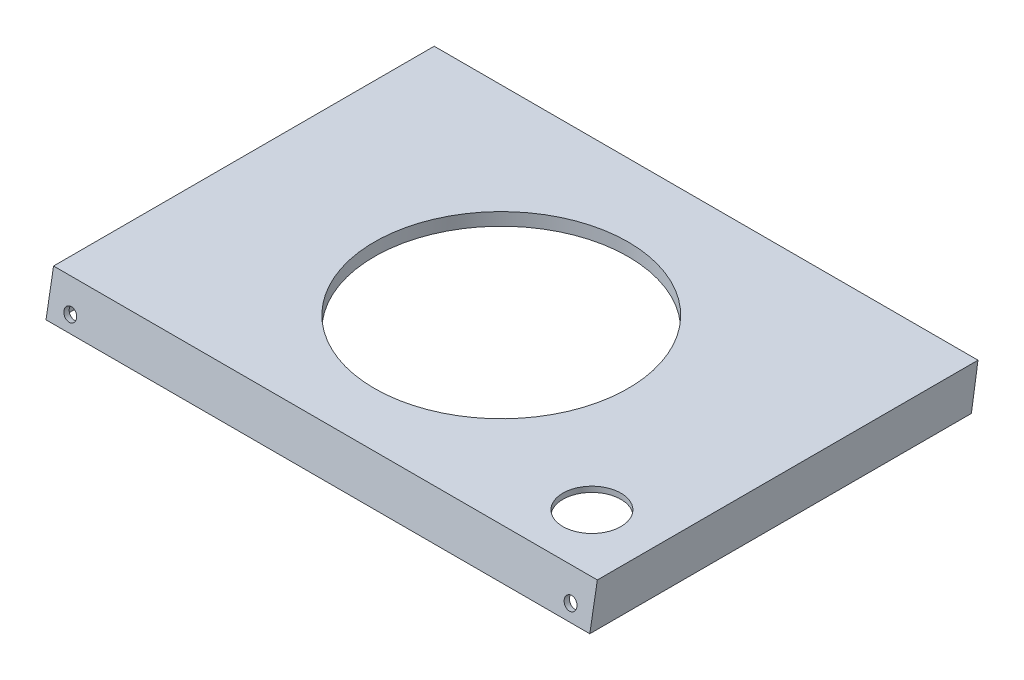
ISO-10303-21;
HEADER;
FILE_DESCRIPTION(('STEP AP214'),'2;1');
FILE_NAME('part.step','',(''),(''),'','','');
FILE_SCHEMA(('AUTOMOTIVE_DESIGN { 1 0 10303 214 1 1 1 1 }'));
ENDSEC;
DATA;
#1=APPLICATION_CONTEXT('core data for automotive mechanical design processes');
#2=APPLICATION_PROTOCOL_DEFINITION('international standard','automotive_design',2000,#1);
#3=PRODUCT_CONTEXT('',#1,'mechanical');
#4=PRODUCT('Part','Part','',(#3));
#5=PRODUCT_RELATED_PRODUCT_CATEGORY('part','',(#4));
#6=PRODUCT_DEFINITION_FORMATION('','',#4);
#7=PRODUCT_DEFINITION_CONTEXT('part definition',#1,'design');
#8=PRODUCT_DEFINITION('design','',#6,#7);
#9=PRODUCT_DEFINITION_SHAPE('','',#8);
#10=(LENGTH_UNIT() NAMED_UNIT(*) SI_UNIT(.MILLI.,.METRE.));
#11=(NAMED_UNIT(*) PLANE_ANGLE_UNIT() SI_UNIT($,.RADIAN.));
#12=(NAMED_UNIT(*) SI_UNIT($,.STERADIAN.) SOLID_ANGLE_UNIT());
#13=UNCERTAINTY_MEASURE_WITH_UNIT(LENGTH_MEASURE(1.E-05),#10,'distance_accuracy_value','');
#14=(GEOMETRIC_REPRESENTATION_CONTEXT(3) GLOBAL_UNCERTAINTY_ASSIGNED_CONTEXT((#13)) GLOBAL_UNIT_ASSIGNED_CONTEXT((#10,
#11,#12)) REPRESENTATION_CONTEXT('',''));
#15=CARTESIAN_POINT('',(0.,0.,0.));
#16=DIRECTION('',(0.,0.,1.));
#17=DIRECTION('',(1.,0.,0.));
#18=AXIS2_PLACEMENT_3D('',#15,#16,#17);
#19=CARTESIAN_POINT('',(0.,0.,0.));
#20=DIRECTION('',(0.,-1.,0.));
#21=DIRECTION('',(0.,0.,-1.));
#22=AXIS2_PLACEMENT_3D('',#19,#20,#21);
#23=PLANE('',#22);
#24=CARTESIAN_POINT('',(131.,0.,-16.));
#25=DIRECTION('',(0.,1.,0.));
#26=DIRECTION('',(0.,0.,1.));
#27=AXIS2_PLACEMENT_3D('',#24,#25,#26);
#28=CIRCLE('',#27,8.00000000000001);
#29=CARTESIAN_POINT('',(131.,0.,-7.99999999999999));
#30=VERTEX_POINT('',#29);
#31=EDGE_CURVE('E207',#30,#30,#28,.T.);
#32=ORIENTED_EDGE('',*,*,#31,.T.);
#33=EDGE_LOOP('',(#32));
#34=FACE_BOUND('',#33,.T.);
#35=DIRECTION('',(-1.,0.,0.));
#36=VECTOR('',#35,1.);
#37=CARTESIAN_POINT('',(0.,0.,-103.476860082171));
#38=LINE('',#37,#36);
#39=CARTESIAN_POINT('',(147.,0.,-103.476860082171));
#40=VERTEX_POINT('',#39);
#41=CARTESIAN_POINT('',(0.,0.,-103.476860082171));
#42=VERTEX_POINT('',#41);
#43=EDGE_CURVE('E196',#40,#42,#38,.T.);
#44=ORIENTED_EDGE('',*,*,#43,.F.);
#45=DIRECTION('',(0.,0.,-1.));
#46=VECTOR('',#45,1.);
#47=CARTESIAN_POINT('',(147.,0.,0.));
#48=LINE('',#47,#46);
#49=CARTESIAN_POINT('',(147.,0.,-1.25864944676594));
#50=VERTEX_POINT('',#49);
#51=EDGE_CURVE('E55',#50,#40,#48,.T.);
#52=ORIENTED_EDGE('',*,*,#51,.F.);
#53=DIRECTION('',(1.,0.,0.));
#54=VECTOR('',#53,1.);
#55=CARTESIAN_POINT('',(0.,0.,-1.25864944676594));
#56=LINE('',#55,#54);
#57=CARTESIAN_POINT('',(0.,0.,-1.25864944676594));
#58=VERTEX_POINT('',#57);
#59=EDGE_CURVE('E50',#58,#50,#56,.T.);
#60=ORIENTED_EDGE('',*,*,#59,.F.);
#61=DIRECTION('',(0.,0.,1.));
#62=VECTOR('',#61,1.);
#63=CARTESIAN_POINT('',(0.,0.,0.));
#64=LINE('',#63,#62);
#65=EDGE_CURVE('E216',#42,#58,#64,.T.);
#66=ORIENTED_EDGE('',*,*,#65,.F.);
#67=EDGE_LOOP('',(#44,#52,#60,#66));
#68=FACE_BOUND('',#67,.T.);
#69=CARTESIAN_POINT('',(141.,0.,-95.657572421231));
#70=DIRECTION('',(0.,-1.,0.));
#71=DIRECTION('',(0.,0.,-1.));
#72=AXIS2_PLACEMENT_3D('',#69,#70,#71);
#73=CIRCLE('',#72,2.99999999999999);
#74=CARTESIAN_POINT('',(141.,0.,-98.657572421231));
#75=VERTEX_POINT('',#74);
#76=EDGE_CURVE('E150',#75,#75,#73,.T.);
#77=ORIENTED_EDGE('',*,*,#76,.F.);
#78=EDGE_LOOP('',(#77));
#79=FACE_BOUND('',#78,.T.);
#80=CARTESIAN_POINT('',(117.,0.,-95.657572421231));
#81=DIRECTION('',(0.,-1.,0.));
#82=DIRECTION('',(0.,0.,1.));
#83=AXIS2_PLACEMENT_3D('',#80,#81,#82);
#84=CIRCLE('',#83,3.00000000000001);
#85=CARTESIAN_POINT('',(117.,0.,-92.657572421231));
#86=VERTEX_POINT('',#85);
#87=EDGE_CURVE('E429',#86,#86,#84,.T.);
#88=ORIENTED_EDGE('',*,*,#87,.F.);
#89=EDGE_LOOP('',(#88));
#90=FACE_BOUND('',#89,.T.);
#91=CARTESIAN_POINT('',(117.,0.,-48.657572421231));
#92=DIRECTION('',(0.,-1.,0.));
#93=DIRECTION('',(0.,0.,-1.));
#94=AXIS2_PLACEMENT_3D('',#91,#92,#93);
#95=CIRCLE('',#94,3.00000000000001);
#96=CARTESIAN_POINT('',(117.,0.,-51.657572421231));
#97=VERTEX_POINT('',#96);
#98=EDGE_CURVE('E420',#97,#97,#95,.T.);
#99=ORIENTED_EDGE('',*,*,#98,.F.);
#100=EDGE_LOOP('',(#99));
#101=FACE_BOUND('',#100,.T.);
#102=CARTESIAN_POINT('',(141.,0.,-48.657572421231));
#103=DIRECTION('',(0.,-1.,0.));
#104=DIRECTION('',(0.,0.,1.));
#105=AXIS2_PLACEMENT_3D('',#102,#103,#104);
#106=CIRCLE('',#105,2.99999999999999);
#107=CARTESIAN_POINT('',(141.,0.,-45.657572421231));
#108=VERTEX_POINT('',#107);
#109=EDGE_CURVE('E411',#108,#108,#106,.T.);
#110=ORIENTED_EDGE('',*,*,#109,.F.);
#111=EDGE_LOOP('',(#110));
#112=FACE_BOUND('',#111,.T.);
#113=CARTESIAN_POINT('',(72.,0.,-50.));
#114=DIRECTION('',(0.,-1.,0.));
#115=DIRECTION('',(0.,0.,-1.));
#116=AXIS2_PLACEMENT_3D('',#113,#114,#115);
#117=CIRCLE('',#116,36.5);
#118=CARTESIAN_POINT('',(72.,0.,-86.5));
#119=VERTEX_POINT('',#118);
#120=EDGE_CURVE('E376',#119,#119,#117,.T.);
#121=ORIENTED_EDGE('',*,*,#120,.F.);
#122=EDGE_LOOP('',(#121));
#123=FACE_BOUND('',#122,.T.);
#124=ADVANCED_FACE('F35',(#34,#68,#79,#90,#101,#112,#123),#23,.T.);
#125=CARTESIAN_POINT('',(0.,1.5,0.));
#126=DIRECTION('',(1.,0.,0.));
#127=DIRECTION('',(0.,0.,-1.));
#128=AXIS2_PLACEMENT_3D('',#125,#126,#127);
#129=PLANE('',#128);
#130=DIRECTION('',(0.,-0.988356848189496,0.152153674411518));
#131=VECTOR('',#130,1.);
#132=CARTESIAN_POINT('',(0.,-10.3176930361465,-103.18071233906));
#133=LINE('',#132,#131);
#134=CARTESIAN_POINT('',(0.,1.5,-105.));
#135=VERTEX_POINT('',#134);
#136=CARTESIAN_POINT('',(0.,-10.3176930361465,-103.18071233906));
#137=VERTEX_POINT('',#136);
#138=EDGE_CURVE('E144',#135,#137,#133,.T.);
#139=ORIENTED_EDGE('',*,*,#138,.F.);
#140=DIRECTION('',(0.,-1.,0.));
#141=VECTOR('',#140,1.);
#142=CARTESIAN_POINT('',(0.,1.5,-105.));
#143=LINE('',#142,#141);
#144=CARTESIAN_POINT('',(0.,0.,-105.));
#145=VERTEX_POINT('',#144);
#146=EDGE_CURVE('E222',#135,#145,#143,.T.);
#147=ORIENTED_EDGE('',*,*,#146,.T.);
#148=DIRECTION('',(0.,-0.984807753012209,0.173648177666924));
#149=VECTOR('',#148,1.);
#150=CARTESIAN_POINT('',(0.,0.,-105.));
#151=LINE('',#150,#149);
#152=EDGE_CURVE('E183',#145,#137,#151,.T.);
#153=ORIENTED_EDGE('',*,*,#152,.T.);
#154=EDGE_LOOP('',(#139,#147,#153));
#155=FACE_BOUND('',#154,.T.);
#156=ADVANCED_FACE('F37',(#155),#129,.F.);
#157=CARTESIAN_POINT('',(147.,1.5,0.));
#158=DIRECTION('',(-1.,0.,0.));
#159=DIRECTION('',(0.,0.,1.));
#160=AXIS2_PLACEMENT_3D('',#157,#158,#159);
#161=PLANE('',#160);
#162=DIRECTION('',(0.,0.988356848189496,-0.152153674411518));
#163=VECTOR('',#162,1.);
#164=CARTESIAN_POINT('',(147.,1.5,-105.));
#165=LINE('',#164,#163);
#166=CARTESIAN_POINT('',(147.,-10.3176930361465,-103.18071233906));
#167=VERTEX_POINT('',#166);
#168=CARTESIAN_POINT('',(147.,1.5,-105.));
#169=VERTEX_POINT('',#168);
#170=EDGE_CURVE('E166',#167,#169,#165,.T.);
#171=ORIENTED_EDGE('',*,*,#170,.F.);
#172=DIRECTION('',(0.,-0.984807753012209,0.173648177666924));
#173=VECTOR('',#172,1.);
#174=CARTESIAN_POINT('',(147.,0.,-105.));
#175=LINE('',#174,#173);
#176=CARTESIAN_POINT('',(147.,0.,-105.));
#177=VERTEX_POINT('',#176);
#178=EDGE_CURVE('E184',#177,#167,#175,.T.);
#179=ORIENTED_EDGE('',*,*,#178,.F.);
#180=DIRECTION('',(0.,-1.,0.));
#181=VECTOR('',#180,1.);
#182=CARTESIAN_POINT('',(147.,1.5,-105.));
#183=LINE('',#182,#181);
#184=EDGE_CURVE('E230',#169,#177,#183,.T.);
#185=ORIENTED_EDGE('',*,*,#184,.F.);
#186=EDGE_LOOP('',(#171,#179,#185));
#187=FACE_BOUND('',#186,.T.);
#188=ADVANCED_FACE('F277',(#187),#161,.F.);
#189=CARTESIAN_POINT('',(0.,1.5,0.));
#190=DIRECTION('',(0.,-1.,0.));
#191=DIRECTION('',(0.,0.,-1.));
#192=AXIS2_PLACEMENT_3D('',#189,#190,#191);
#193=PLANE('',#192);
#194=DIRECTION('',(1.,0.,0.));
#195=VECTOR('',#194,1.);
#196=CARTESIAN_POINT('',(0.,1.5,0.));
#197=LINE('',#196,#195);
#198=CARTESIAN_POINT('',(-1.5,1.5,0.));
#199=VERTEX_POINT('',#198);
#200=CARTESIAN_POINT('',(148.5,1.5,0.));
#201=VERTEX_POINT('',#200);
#202=EDGE_CURVE('E135',#199,#201,#197,.T.);
#203=ORIENTED_EDGE('',*,*,#202,.T.);
#204=DIRECTION('',(0.,0.,1.));
#205=VECTOR('',#204,1.);
#206=CARTESIAN_POINT('',(148.5,1.5,0.));
#207=LINE('',#206,#205);
#208=CARTESIAN_POINT('',(148.5,1.5,-105.));
#209=VERTEX_POINT('',#208);
#210=EDGE_CURVE('E168',#209,#201,#207,.T.);
#211=ORIENTED_EDGE('',*,*,#210,.F.);
#212=DIRECTION('',(-1.,0.,0.));
#213=VECTOR('',#212,1.);
#214=CARTESIAN_POINT('',(148.5,1.5,-105.));
#215=LINE('',#214,#213);
#216=EDGE_CURVE('E173',#209,#169,#215,.T.);
#217=ORIENTED_EDGE('',*,*,#216,.T.);
#218=DIRECTION('',(-1.,0.,0.));
#219=VECTOR('',#218,1.);
#220=CARTESIAN_POINT('',(0.,1.5,-105.));
#221=LINE('',#220,#219);
#222=EDGE_CURVE('E218',#169,#135,#221,.T.);
#223=ORIENTED_EDGE('',*,*,#222,.T.);
#224=DIRECTION('',(1.,0.,0.));
#225=VECTOR('',#224,1.);
#226=CARTESIAN_POINT('',(-1.5,1.5,-105.));
#227=LINE('',#226,#225);
#228=CARTESIAN_POINT('',(-1.5,1.5,-105.));
#229=VERTEX_POINT('',#228);
#230=EDGE_CURVE('E160',#229,#135,#227,.T.);
#231=ORIENTED_EDGE('',*,*,#230,.F.);
#232=DIRECTION('',(0.,0.,-1.));
#233=VECTOR('',#232,1.);
#234=CARTESIAN_POINT('',(-1.5,1.5,-105.));
#235=LINE('',#234,#233);
#236=EDGE_CURVE('E138',#199,#229,#235,.T.);
#237=ORIENTED_EDGE('',*,*,#236,.F.);
#238=EDGE_LOOP('',(#203,#211,#217,#223,#231,#237));
#239=FACE_BOUND('',#238,.T.);
#240=CARTESIAN_POINT('',(72.,1.5,-50.));
#241=DIRECTION('',(0.,1.,0.));
#242=DIRECTION('',(0.,0.,1.));
#243=AXIS2_PLACEMENT_3D('',#240,#241,#242);
#244=CIRCLE('',#243,35.);
#245=CARTESIAN_POINT('',(72.,1.5,-15.));
#246=VERTEX_POINT('',#245);
#247=EDGE_CURVE('E211',#246,#246,#244,.T.);
#248=ORIENTED_EDGE('',*,*,#247,.F.);
#249=EDGE_LOOP('',(#248));
#250=FACE_BOUND('',#249,.T.);
#251=CARTESIAN_POINT('',(131.,1.5,-16.));
#252=DIRECTION('',(0.,1.,0.));
#253=DIRECTION('',(0.,0.,1.));
#254=AXIS2_PLACEMENT_3D('',#251,#252,#253);
#255=CIRCLE('',#254,8.00000000000001);
#256=CARTESIAN_POINT('',(131.,1.5,-7.99999999999999));
#257=VERTEX_POINT('',#256);
#258=EDGE_CURVE('E208',#257,#257,#255,.T.);
#259=ORIENTED_EDGE('',*,*,#258,.F.);
#260=EDGE_LOOP('',(#259));
#261=FACE_BOUND('',#260,.T.);
#262=ADVANCED_FACE('F355',(#239,#250,#261),#193,.F.);
#263=CARTESIAN_POINT('',(0.,1.5,-105.));
#264=DIRECTION('',(0.,0.,1.));
#265=DIRECTION('',(1.,0.,0.));
#266=AXIS2_PLACEMENT_3D('',#263,#264,#265);
#267=PLANE('',#266);
#268=DIRECTION('',(-1.,0.,0.));
#269=VECTOR('',#268,1.);
#270=CARTESIAN_POINT('',(0.,0.,-105.));
#271=LINE('',#270,#269);
#272=EDGE_CURVE('E219',#177,#145,#271,.T.);
#273=ORIENTED_EDGE('',*,*,#272,.T.);
#274=ORIENTED_EDGE('',*,*,#146,.F.);
#275=ORIENTED_EDGE('',*,*,#222,.F.);
#276=ORIENTED_EDGE('',*,*,#184,.T.);
#277=EDGE_LOOP('',(#273,#274,#275,#276));
#278=FACE_BOUND('',#277,.T.);
#279=ADVANCED_FACE('F353',(#278),#267,.F.);
#280=CARTESIAN_POINT('',(72.,1.5,-50.));
#281=DIRECTION('',(0.,-1.,0.));
#282=DIRECTION('',(0.,0.,-1.));
#283=AXIS2_PLACEMENT_3D('',#280,#281,#282);
#284=CYLINDRICAL_SURFACE('',#283,35.);
#285=ORIENTED_EDGE('',*,*,#247,.T.);
#286=EDGE_LOOP('',(#285));
#287=FACE_BOUND('',#286,.T.);
#288=CARTESIAN_POINT('',(72.,-2.,-50.));
#289=DIRECTION('',(0.,-1.,0.));
#290=DIRECTION('',(0.,0.,-1.));
#291=AXIS2_PLACEMENT_3D('',#288,#289,#290);
#292=CIRCLE('',#291,35.);
#293=CARTESIAN_POINT('',(72.,-2.,-85.));
#294=VERTEX_POINT('',#293);
#295=EDGE_CURVE('E374',#294,#294,#292,.T.);
#296=ORIENTED_EDGE('',*,*,#295,.T.);
#297=EDGE_LOOP('',(#296));
#298=FACE_BOUND('',#297,.T.);
#299=ADVANCED_FACE('F350',(#287,#298),#284,.F.);
#300=CARTESIAN_POINT('',(131.,1.5,-16.));
#301=DIRECTION('',(0.,-1.,0.));
#302=DIRECTION('',(0.,0.,-1.));
#303=AXIS2_PLACEMENT_3D('',#300,#301,#302);
#304=CYLINDRICAL_SURFACE('',#303,8.00000000000001);
#305=ORIENTED_EDGE('',*,*,#258,.T.);
#306=EDGE_LOOP('',(#305));
#307=FACE_BOUND('',#306,.T.);
#308=ORIENTED_EDGE('',*,*,#31,.F.);
#309=EDGE_LOOP('',(#308));
#310=FACE_BOUND('',#309,.T.);
#311=ADVANCED_FACE('F340',(#307,#310),#304,.F.);
#312=CARTESIAN_POINT('',(147.,1.5,0.));
#313=DIRECTION('',(0.,0.173648177666924,0.984807753012209));
#314=DIRECTION('',(0.,-0.984807753012209,0.173648177666924));
#315=AXIS2_PLACEMENT_3D('',#312,#313,#314);
#316=PLANE('',#315);
#317=CARTESIAN_POINT('',(4.49999999999999,-6.37846202409767,1.38918542133539));
#318=DIRECTION('',(0.,0.173648177666924,0.984807753012209));
#319=DIRECTION('',(0.,-0.984807753012209,0.173648177666924));
#320=AXIS2_PLACEMENT_3D('',#317,#318,#319);
#321=CIRCLE('',#320,1.74999999999999);
#322=CARTESIAN_POINT('',(4.49999999999999,-8.10187559186903,1.6930697322525));
#323=VERTEX_POINT('',#322);
#324=EDGE_CURVE('E385',#323,#323,#321,.T.);
#325=ORIENTED_EDGE('',*,*,#324,.F.);
#326=EDGE_LOOP('',(#325));
#327=FACE_BOUND('',#326,.T.);
#328=CARTESIAN_POINT('',(142.5,-6.37846202409767,1.38918542133539));
#329=DIRECTION('',(0.,0.173648177666924,0.984807753012209));
#330=DIRECTION('',(0.,0.984807753012209,-0.173648177666924));
#331=AXIS2_PLACEMENT_3D('',#328,#329,#330);
#332=CIRCLE('',#331,1.74999999999998);
#333=CARTESIAN_POINT('',(142.5,-4.65504845632633,1.08530111041828));
#334=VERTEX_POINT('',#333);
#335=EDGE_CURVE('E392',#334,#334,#332,.T.);
#336=ORIENTED_EDGE('',*,*,#335,.F.);
#337=EDGE_LOOP('',(#336));
#338=FACE_BOUND('',#337,.T.);
#339=ORIENTED_EDGE('',*,*,#202,.F.);
#340=DIRECTION('',(0.,0.984807753012209,-0.173648177666924));
#341=VECTOR('',#340,1.);
#342=CARTESIAN_POINT('',(-1.5,1.5,0.));
#343=LINE('',#342,#341);
#344=CARTESIAN_POINT('',(-1.5,-10.3176930361465,2.08377813200309));
#345=VERTEX_POINT('',#344);
#346=EDGE_CURVE('E133',#345,#199,#343,.T.);
#347=ORIENTED_EDGE('',*,*,#346,.F.);
#348=DIRECTION('',(-1.,0.,0.));
#349=VECTOR('',#348,1.);
#350=CARTESIAN_POINT('',(147.,-10.3176930361465,2.08377813200309));
#351=LINE('',#350,#349);
#352=CARTESIAN_POINT('',(148.5,-10.3176930361465,2.08377813200309));
#353=VERTEX_POINT('',#352);
#354=EDGE_CURVE('E118',#353,#345,#351,.T.);
#355=ORIENTED_EDGE('',*,*,#354,.F.);
#356=DIRECTION('',(0.,-0.984807753012209,0.173648177666924));
#357=VECTOR('',#356,1.);
#358=CARTESIAN_POINT('',(148.5,-10.3176930361465,2.08377813200309));
#359=LINE('',#358,#357);
#360=EDGE_CURVE('E171',#201,#353,#359,.T.);
#361=ORIENTED_EDGE('',*,*,#360,.F.);
#362=EDGE_LOOP('',(#339,#347,#355,#361));
#363=FACE_BOUND('',#362,.T.);
#364=ADVANCED_FACE('F134',(#327,#338,#363),#316,.T.);
#365=CARTESIAN_POINT('',(147.,-10.3176930361465,2.08377813200309));
#366=DIRECTION('',(0.,-1.,0.));
#367=DIRECTION('',(0.,0.,-1.));
#368=AXIS2_PLACEMENT_3D('',#365,#366,#367);
#369=PLANE('',#368);
#370=DIRECTION('',(-1.,0.,0.));
#371=VECTOR('',#370,1.);
#372=CARTESIAN_POINT('',(147.,-10.3176930361465,-101.657572421231));
#373=LINE('',#372,#371);
#374=CARTESIAN_POINT('',(147.,-10.3176930361465,-101.657572421231));
#375=VERTEX_POINT('',#374);
#376=CARTESIAN_POINT('',(0.,-10.3176930361465,-101.657572421231));
#377=VERTEX_POINT('',#376);
#378=EDGE_CURVE('E194',#375,#377,#373,.T.);
#379=ORIENTED_EDGE('',*,*,#378,.T.);
#380=DIRECTION('',(0.,0.,1.));
#381=VECTOR('',#380,1.);
#382=CARTESIAN_POINT('',(0.,-10.3176930361465,2.08377813200309));
#383=LINE('',#382,#381);
#384=CARTESIAN_POINT('',(0.,-10.3176930361465,0.56063821417447));
#385=VERTEX_POINT('',#384);
#386=EDGE_CURVE('E147',#377,#385,#383,.T.);
#387=ORIENTED_EDGE('',*,*,#386,.T.);
#388=DIRECTION('',(-1.,0.,0.));
#389=VECTOR('',#388,1.);
#390=CARTESIAN_POINT('',(147.,-10.3176930361465,0.56063821417447));
#391=LINE('',#390,#389);
#392=CARTESIAN_POINT('',(147.,-10.3176930361465,0.56063821417447));
#393=VERTEX_POINT('',#392);
#394=EDGE_CURVE('E130',#393,#385,#391,.T.);
#395=ORIENTED_EDGE('',*,*,#394,.F.);
#396=DIRECTION('',(0.,0.,-1.));
#397=VECTOR('',#396,1.);
#398=CARTESIAN_POINT('',(147.,-10.3176930361465,-103.18071233906));
#399=LINE('',#398,#397);
#400=EDGE_CURVE('E163',#393,#375,#399,.T.);
#401=ORIENTED_EDGE('',*,*,#400,.T.);
#402=EDGE_LOOP('',(#379,#387,#395,#401));
#403=FACE_BOUND('',#402,.T.);
#404=ORIENTED_EDGE('',*,*,#354,.T.);
#405=DIRECTION('',(0.,0.,1.));
#406=VECTOR('',#405,1.);
#407=CARTESIAN_POINT('',(-1.5,-10.3176930361465,2.08377813200309));
#408=LINE('',#407,#406);
#409=CARTESIAN_POINT('',(-1.5,-10.3176930361465,-103.18071233906));
#410=VERTEX_POINT('',#409);
#411=EDGE_CURVE('E123',#410,#345,#408,.T.);
#412=ORIENTED_EDGE('',*,*,#411,.F.);
#413=DIRECTION('',(1.,0.,0.));
#414=VECTOR('',#413,1.);
#415=CARTESIAN_POINT('',(-1.5,-10.3176930361465,-103.18071233906));
#416=LINE('',#415,#414);
#417=EDGE_CURVE('E155',#410,#137,#416,.T.);
#418=ORIENTED_EDGE('',*,*,#417,.T.);
#419=DIRECTION('',(-1.,0.,0.));
#420=VECTOR('',#419,1.);
#421=CARTESIAN_POINT('',(147.,-10.3176930361465,-103.18071233906));
#422=LINE('',#421,#420);
#423=EDGE_CURVE('E190',#167,#137,#422,.T.);
#424=ORIENTED_EDGE('',*,*,#423,.F.);
#425=DIRECTION('',(-1.,0.,0.));
#426=VECTOR('',#425,1.);
#427=CARTESIAN_POINT('',(148.5,-10.3176930361465,-103.18071233906));
#428=LINE('',#427,#426);
#429=CARTESIAN_POINT('',(148.5,-10.3176930361465,-103.18071233906));
#430=VERTEX_POINT('',#429);
#431=EDGE_CURVE('E180',#430,#167,#428,.T.);
#432=ORIENTED_EDGE('',*,*,#431,.F.);
#433=DIRECTION('',(0.,0.,-1.));
#434=VECTOR('',#433,1.);
#435=CARTESIAN_POINT('',(148.5,-10.3176930361465,-103.18071233906));
#436=LINE('',#435,#434);
#437=EDGE_CURVE('E126',#353,#430,#436,.T.);
#438=ORIENTED_EDGE('',*,*,#437,.F.);
#439=EDGE_LOOP('',(#404,#412,#418,#424,#432,#438));
#440=FACE_BOUND('',#439,.T.);
#441=ADVANCED_FACE('F120',(#403,#440),#369,.T.);
#442=CARTESIAN_POINT('',(147.,-10.3176930361465,0.56063821417447));
#443=DIRECTION('',(0.,-0.173648177666925,-0.984807753012209));
#444=DIRECTION('',(0.,0.984807753012209,-0.173648177666925));
#445=AXIS2_PLACEMENT_3D('',#442,#443,#444);
#446=PLANE('',#445);
#447=CARTESIAN_POINT('',(4.49999999999999,-6.63893429059806,-0.0880262081829064));
#448=DIRECTION('',(0.,-0.173648177666925,-0.984807753012209));
#449=DIRECTION('',(0.,0.984807753012209,-0.173648177666925));
#450=AXIS2_PLACEMENT_3D('',#447,#448,#449);
#451=CIRCLE('',#450,1.74999999999999);
#452=CARTESIAN_POINT('',(4.49999999999999,-4.91552072282671,-0.391910519100022));
#453=VERTEX_POINT('',#452);
#454=EDGE_CURVE('E389',#453,#453,#451,.F.);
#455=ORIENTED_EDGE('',*,*,#454,.T.);
#456=EDGE_LOOP('',(#455));
#457=FACE_BOUND('',#456,.T.);
#458=CARTESIAN_POINT('',(142.5,-6.63893429059806,-0.0880262081829064));
#459=DIRECTION('',(0.,-0.173648177666925,-0.984807753012209));
#460=DIRECTION('',(0.,0.984807753012209,-0.173648177666925));
#461=AXIS2_PLACEMENT_3D('',#458,#459,#460);
#462=CIRCLE('',#461,1.74999999999998);
#463=CARTESIAN_POINT('',(142.5,-4.91552072282671,-0.391910519100021));
#464=VERTEX_POINT('',#463);
#465=EDGE_CURVE('E383',#464,#464,#462,.F.);
#466=ORIENTED_EDGE('',*,*,#465,.T.);
#467=EDGE_LOOP('',(#466));
#468=FACE_BOUND('',#467,.T.);
#469=DIRECTION('',(0.,-0.984807753012209,0.173648177666925));
#470=VECTOR('',#469,1.);
#471=CARTESIAN_POINT('',(0.,-10.3176930361465,0.56063821417447));
#472=LINE('',#471,#470);
#473=EDGE_CURVE('E200',#58,#385,#472,.T.);
#474=ORIENTED_EDGE('',*,*,#473,.F.);
#475=ORIENTED_EDGE('',*,*,#59,.T.);
#476=DIRECTION('',(0.,-0.984807753012209,0.173648177666925));
#477=VECTOR('',#476,1.);
#478=CARTESIAN_POINT('',(147.,-10.3176930361465,0.56063821417447));
#479=LINE('',#478,#477);
#480=EDGE_CURVE('E201',#50,#393,#479,.T.);
#481=ORIENTED_EDGE('',*,*,#480,.T.);
#482=ORIENTED_EDGE('',*,*,#394,.T.);
#483=EDGE_LOOP('',(#474,#475,#481,#482));
#484=FACE_BOUND('',#483,.T.);
#485=ADVANCED_FACE('F333',(#457,#468,#484),#446,.T.);
#486=CARTESIAN_POINT('',(147.,-10.3176930361465,-101.657572421231));
#487=DIRECTION('',(0.,0.173648177666923,0.984807753012209));
#488=DIRECTION('',(0.,-0.984807753012209,0.173648177666923));
#489=AXIS2_PLACEMENT_3D('',#486,#487,#488);
#490=PLANE('',#489);
#491=CARTESIAN_POINT('',(142.5,-6.11798975759729,-102.398093420209));
#492=DIRECTION('',(0.,0.173648177666923,0.984807753012209));
#493=DIRECTION('',(0.,-0.984807753012209,0.173648177666923));
#494=AXIS2_PLACEMENT_3D('',#491,#492,#493);
#495=CIRCLE('',#494,1.75000000000001);
#496=CARTESIAN_POINT('',(142.5,-7.84140332536867,-102.094209109292));
#497=VERTEX_POINT('',#496);
#498=EDGE_CURVE('E401',#497,#497,#495,.F.);
#499=ORIENTED_EDGE('',*,*,#498,.T.);
#500=EDGE_LOOP('',(#499));
#501=FACE_BOUND('',#500,.T.);
#502=CARTESIAN_POINT('',(4.49999999999998,-6.11798975759729,-102.398093420209));
#503=DIRECTION('',(0.,0.173648177666923,0.984807753012209));
#504=DIRECTION('',(0.,-0.984807753012209,0.173648177666923));
#505=AXIS2_PLACEMENT_3D('',#502,#503,#504);
#506=CIRCLE('',#505,1.75000000000001);
#507=CARTESIAN_POINT('',(4.49999999999998,-7.84140332536866,-102.094209109292));
#508=VERTEX_POINT('',#507);
#509=EDGE_CURVE('E388',#508,#508,#506,.F.);
#510=ORIENTED_EDGE('',*,*,#509,.T.);
#511=EDGE_LOOP('',(#510));
#512=FACE_BOUND('',#511,.T.);
#513=DIRECTION('',(0.,0.984807753012209,-0.173648177666923));
#514=VECTOR('',#513,1.);
#515=CARTESIAN_POINT('',(147.,-10.3176930361465,-101.657572421231));
#516=LINE('',#515,#514);
#517=EDGE_CURVE('E187',#375,#40,#516,.T.);
#518=ORIENTED_EDGE('',*,*,#517,.T.);
#519=ORIENTED_EDGE('',*,*,#43,.T.);
#520=DIRECTION('',(0.,0.984807753012209,-0.173648177666923));
#521=VECTOR('',#520,1.);
#522=CARTESIAN_POINT('',(0.,-10.3176930361465,-101.657572421231));
#523=LINE('',#522,#521);
#524=EDGE_CURVE('E188',#377,#42,#523,.T.);
#525=ORIENTED_EDGE('',*,*,#524,.F.);
#526=ORIENTED_EDGE('',*,*,#378,.F.);
#527=EDGE_LOOP('',(#518,#519,#525,#526));
#528=FACE_BOUND('',#527,.T.);
#529=ADVANCED_FACE('F330',(#501,#512,#528),#490,.T.);
#530=CARTESIAN_POINT('',(147.,0.,-105.));
#531=DIRECTION('',(0.,-0.173648177666924,-0.984807753012209));
#532=DIRECTION('',(0.,0.984807753012209,-0.173648177666924));
#533=AXIS2_PLACEMENT_3D('',#530,#531,#532);
#534=PLANE('',#533);
#535=CARTESIAN_POINT('',(142.5,-6.37846202409769,-103.875305049727));
#536=DIRECTION('',(0.,-0.173648177666925,-0.984807753012209));
#537=DIRECTION('',(0.,0.984807753012209,-0.173648177666925));
#538=AXIS2_PLACEMENT_3D('',#535,#536,#537);
#539=CIRCLE('',#538,1.75000000000001);
#540=CARTESIAN_POINT('',(142.5,-4.65504845632631,-104.179189360644));
#541=VERTEX_POINT('',#540);
#542=EDGE_CURVE('E397',#541,#541,#539,.T.);
#543=ORIENTED_EDGE('',*,*,#542,.F.);
#544=EDGE_LOOP('',(#543));
#545=FACE_BOUND('',#544,.T.);
#546=CARTESIAN_POINT('',(4.49999999999998,-6.37846202409769,-103.875305049727));
#547=DIRECTION('',(0.,-0.173648177666925,-0.984807753012209));
#548=DIRECTION('',(0.,-0.984807753012209,0.173648177666925));
#549=AXIS2_PLACEMENT_3D('',#546,#547,#548);
#550=CIRCLE('',#549,1.75000000000001);
#551=CARTESIAN_POINT('',(4.49999999999998,-8.10187559186906,-103.57142073881));
#552=VERTEX_POINT('',#551);
#553=EDGE_CURVE('E404',#552,#552,#550,.T.);
#554=ORIENTED_EDGE('',*,*,#553,.F.);
#555=EDGE_LOOP('',(#554));
#556=FACE_BOUND('',#555,.T.);
#557=ORIENTED_EDGE('',*,*,#152,.F.);
#558=ORIENTED_EDGE('',*,*,#272,.F.);
#559=ORIENTED_EDGE('',*,*,#178,.T.);
#560=ORIENTED_EDGE('',*,*,#423,.T.);
#561=EDGE_LOOP('',(#557,#558,#559,#560));
#562=FACE_BOUND('',#561,.T.);
#563=ADVANCED_FACE('F328',(#545,#556,#562),#534,.T.);
#564=CARTESIAN_POINT('',(148.5,1.5,-105.));
#565=DIRECTION('',(0.,0.152153674411518,0.988356848189496));
#566=DIRECTION('',(0.,-0.988356848189496,0.152153674411518));
#567=AXIS2_PLACEMENT_3D('',#564,#565,#566);
#568=PLANE('',#567);
#569=ORIENTED_EDGE('',*,*,#170,.T.);
#570=ORIENTED_EDGE('',*,*,#216,.F.);
#571=DIRECTION('',(0.,0.988356848189496,-0.152153674411518));
#572=VECTOR('',#571,1.);
#573=CARTESIAN_POINT('',(148.5,1.5,-105.));
#574=LINE('',#573,#572);
#575=EDGE_CURVE('E165',#430,#209,#574,.T.);
#576=ORIENTED_EDGE('',*,*,#575,.F.);
#577=ORIENTED_EDGE('',*,*,#431,.T.);
#578=EDGE_LOOP('',(#569,#570,#576,#577));
#579=FACE_BOUND('',#578,.T.);
#580=ADVANCED_FACE('F321',(#579),#568,.F.);
#581=CARTESIAN_POINT('',(148.5,0.,0.));
#582=DIRECTION('',(1.,0.,0.));
#583=DIRECTION('',(0.,0.,-1.));
#584=AXIS2_PLACEMENT_3D('',#581,#582,#583);
#585=PLANE('',#584);
#586=ORIENTED_EDGE('',*,*,#437,.T.);
#587=ORIENTED_EDGE('',*,*,#575,.T.);
#588=ORIENTED_EDGE('',*,*,#210,.T.);
#589=ORIENTED_EDGE('',*,*,#360,.T.);
#590=EDGE_LOOP('',(#586,#587,#588,#589));
#591=FACE_BOUND('',#590,.T.);
#592=ADVANCED_FACE('F318',(#591),#585,.T.);
#593=CARTESIAN_POINT('',(147.,0.,0.));
#594=DIRECTION('',(1.,0.,0.));
#595=DIRECTION('',(0.,0.,-1.));
#596=AXIS2_PLACEMENT_3D('',#593,#594,#595);
#597=PLANE('',#596);
#598=ORIENTED_EDGE('',*,*,#517,.F.);
#599=ORIENTED_EDGE('',*,*,#400,.F.);
#600=ORIENTED_EDGE('',*,*,#480,.F.);
#601=ORIENTED_EDGE('',*,*,#51,.T.);
#602=EDGE_LOOP('',(#598,#599,#600,#601));
#603=FACE_BOUND('',#602,.T.);
#604=ADVANCED_FACE('F316',(#603),#597,.F.);
#605=CARTESIAN_POINT('',(-1.5,-10.3176930361465,-103.18071233906));
#606=DIRECTION('',(0.,0.152153674411518,0.988356848189496));
#607=DIRECTION('',(0.,-0.988356848189496,0.152153674411518));
#608=AXIS2_PLACEMENT_3D('',#605,#606,#607);
#609=PLANE('',#608);
#610=ORIENTED_EDGE('',*,*,#138,.T.);
#611=ORIENTED_EDGE('',*,*,#417,.F.);
#612=DIRECTION('',(0.,-0.988356848189496,0.152153674411518));
#613=VECTOR('',#612,1.);
#614=CARTESIAN_POINT('',(-1.5,-10.3176930361465,-103.18071233906));
#615=LINE('',#614,#613);
#616=EDGE_CURVE('E142',#229,#410,#615,.T.);
#617=ORIENTED_EDGE('',*,*,#616,.F.);
#618=ORIENTED_EDGE('',*,*,#230,.T.);
#619=EDGE_LOOP('',(#610,#611,#617,#618));
#620=FACE_BOUND('',#619,.T.);
#621=ADVANCED_FACE('F310',(#620),#609,.F.);
#622=CARTESIAN_POINT('',(-1.5,0.,0.));
#623=DIRECTION('',(1.,0.,0.));
#624=DIRECTION('',(0.,0.,-1.));
#625=AXIS2_PLACEMENT_3D('',#622,#623,#624);
#626=PLANE('',#625);
#627=ORIENTED_EDGE('',*,*,#411,.T.);
#628=ORIENTED_EDGE('',*,*,#346,.T.);
#629=ORIENTED_EDGE('',*,*,#236,.T.);
#630=ORIENTED_EDGE('',*,*,#616,.T.);
#631=EDGE_LOOP('',(#627,#628,#629,#630));
#632=FACE_BOUND('',#631,.T.);
#633=ADVANCED_FACE('F140',(#632),#626,.F.);
#634=CARTESIAN_POINT('',(0.,0.,0.));
#635=DIRECTION('',(1.,0.,0.));
#636=DIRECTION('',(0.,0.,-1.));
#637=AXIS2_PLACEMENT_3D('',#634,#635,#636);
#638=PLANE('',#637);
#639=ORIENTED_EDGE('',*,*,#386,.F.);
#640=ORIENTED_EDGE('',*,*,#524,.T.);
#641=ORIENTED_EDGE('',*,*,#65,.T.);
#642=ORIENTED_EDGE('',*,*,#473,.T.);
#643=EDGE_LOOP('',(#639,#640,#641,#642));
#644=FACE_BOUND('',#643,.T.);
#645=ADVANCED_FACE('F305',(#644),#638,.T.);
#646=CARTESIAN_POINT('',(141.,-5.,-95.657572421231));
#647=DIRECTION('',(0.,-1.,0.));
#648=DIRECTION('',(0.,0.,-1.));
#649=AXIS2_PLACEMENT_3D('',#646,#647,#648);
#650=PLANE('',#649);
#651=CARTESIAN_POINT('',(141.,-5.,-95.657572421231));
#652=DIRECTION('',(0.,-1.,0.));
#653=DIRECTION('',(0.,0.,-1.));
#654=AXIS2_PLACEMENT_3D('',#651,#652,#653);
#655=CIRCLE('',#654,2.99999999999999);
#656=CARTESIAN_POINT('',(141.,-5.,-98.657572421231));
#657=VERTEX_POINT('',#656);
#658=EDGE_CURVE('E157',#657,#657,#655,.T.);
#659=ORIENTED_EDGE('',*,*,#658,.T.);
#660=EDGE_LOOP('',(#659));
#661=FACE_BOUND('',#660,.T.);
#662=CARTESIAN_POINT('',(141.,-5.,-95.657572421231));
#663=DIRECTION('',(0.,-1.,0.));
#664=DIRECTION('',(0.,0.,-1.));
#665=AXIS2_PLACEMENT_3D('',#662,#663,#664);
#666=CIRCLE('',#665,1.09999999999999);
#667=CARTESIAN_POINT('',(141.,-5.,-96.757572421231));
#668=VERTEX_POINT('',#667);
#669=EDGE_CURVE('E433',#668,#668,#666,.T.);
#670=ORIENTED_EDGE('',*,*,#669,.F.);
#671=EDGE_LOOP('',(#670));
#672=FACE_BOUND('',#671,.T.);
#673=ADVANCED_FACE('F298',(#661,#672),#650,.T.);
#674=CARTESIAN_POINT('',(141.,-5.,-95.657572421231));
#675=DIRECTION('',(0.,1.,0.));
#676=DIRECTION('',(0.,0.,1.));
#677=AXIS2_PLACEMENT_3D('',#674,#675,#676);
#678=CYLINDRICAL_SURFACE('',#677,2.99999999999999);
#679=ORIENTED_EDGE('',*,*,#658,.F.);
#680=EDGE_LOOP('',(#679));
#681=FACE_BOUND('',#680,.T.);
#682=ORIENTED_EDGE('',*,*,#76,.T.);
#683=EDGE_LOOP('',(#682));
#684=FACE_BOUND('',#683,.T.);
#685=ADVANCED_FACE('F290',(#681,#684),#678,.T.);
#686=CARTESIAN_POINT('',(141.,-5.,-95.657572421231));
#687=DIRECTION('',(0.,1.,0.));
#688=DIRECTION('',(0.,0.,1.));
#689=AXIS2_PLACEMENT_3D('',#686,#687,#688);
#690=CYLINDRICAL_SURFACE('',#689,1.09999999999999);
#691=ORIENTED_EDGE('',*,*,#669,.T.);
#692=EDGE_LOOP('',(#691));
#693=FACE_BOUND('',#692,.T.);
#694=CARTESIAN_POINT('',(141.,0.,-95.657572421231));
#695=DIRECTION('',(0.,-1.,0.));
#696=DIRECTION('',(0.,0.,-1.));
#697=AXIS2_PLACEMENT_3D('',#694,#695,#696);
#698=CIRCLE('',#697,1.09999999999999);
#699=CARTESIAN_POINT('',(141.,0.,-96.757572421231));
#700=VERTEX_POINT('',#699);
#701=EDGE_CURVE('E233',#700,#700,#698,.F.);
#702=ORIENTED_EDGE('',*,*,#701,.T.);
#703=EDGE_LOOP('',(#702));
#704=FACE_BOUND('',#703,.T.);
#705=ADVANCED_FACE('F281',(#693,#704),#690,.F.);
#706=ORIENTED_EDGE('',*,*,#701,.F.);
#707=EDGE_LOOP('',(#706));
#708=FACE_BOUND('',#707,.T.);
#709=ADVANCED_FACE('F265',(#708),#23,.T.);
#710=CARTESIAN_POINT('',(117.,-5.,-95.657572421231));
#711=DIRECTION('',(0.,1.,0.));
#712=DIRECTION('',(0.,0.,1.));
#713=AXIS2_PLACEMENT_3D('',#710,#711,#712);
#714=PLANE('',#713);
#715=CARTESIAN_POINT('',(117.,-5.,-95.657572421231));
#716=DIRECTION('',(0.,-1.,0.));
#717=DIRECTION('',(0.,0.,1.));
#718=AXIS2_PLACEMENT_3D('',#715,#716,#717);
#719=CIRCLE('',#718,3.00000000000001);
#720=CARTESIAN_POINT('',(117.,-5.,-92.657572421231));
#721=VERTEX_POINT('',#720);
#722=EDGE_CURVE('E430',#721,#721,#719,.T.);
#723=ORIENTED_EDGE('',*,*,#722,.T.);
#724=EDGE_LOOP('',(#723));
#725=FACE_BOUND('',#724,.T.);
#726=CARTESIAN_POINT('',(117.,-5.,-95.657572421231));
#727=DIRECTION('',(0.,-1.,0.));
#728=DIRECTION('',(0.,0.,1.));
#729=AXIS2_PLACEMENT_3D('',#726,#727,#728);
#730=CIRCLE('',#729,1.10000000000001);
#731=CARTESIAN_POINT('',(117.,-5.,-94.557572421231));
#732=VERTEX_POINT('',#731);
#733=EDGE_CURVE('E424',#732,#732,#730,.T.);
#734=ORIENTED_EDGE('',*,*,#733,.F.);
#735=EDGE_LOOP('',(#734));
#736=FACE_BOUND('',#735,.T.);
#737=ADVANCED_FACE('F280',(#725,#736),#714,.F.);
#738=CARTESIAN_POINT('',(117.,-5.,-95.657572421231));
#739=DIRECTION('',(0.,1.,0.));
#740=DIRECTION('',(0.,0.,1.));
#741=AXIS2_PLACEMENT_3D('',#738,#739,#740);
#742=CYLINDRICAL_SURFACE('',#741,3.00000000000001);
#743=ORIENTED_EDGE('',*,*,#722,.F.);
#744=EDGE_LOOP('',(#743));
#745=FACE_BOUND('',#744,.T.);
#746=ORIENTED_EDGE('',*,*,#87,.T.);
#747=EDGE_LOOP('',(#746));
#748=FACE_BOUND('',#747,.T.);
#749=ADVANCED_FACE('F287',(#745,#748),#742,.T.);
#750=CARTESIAN_POINT('',(117.,-5.,-95.657572421231));
#751=DIRECTION('',(0.,1.,0.));
#752=DIRECTION('',(0.,0.,1.));
#753=AXIS2_PLACEMENT_3D('',#750,#751,#752);
#754=CYLINDRICAL_SURFACE('',#753,1.10000000000001);
#755=ORIENTED_EDGE('',*,*,#733,.T.);
#756=EDGE_LOOP('',(#755));
#757=FACE_BOUND('',#756,.T.);
#758=CARTESIAN_POINT('',(117.,0.,-95.657572421231));
#759=DIRECTION('',(0.,-1.,0.));
#760=DIRECTION('',(0.,0.,-1.));
#761=AXIS2_PLACEMENT_3D('',#758,#759,#760);
#762=CIRCLE('',#761,1.10000000000001);
#763=CARTESIAN_POINT('',(117.,0.,-96.757572421231));
#764=VERTEX_POINT('',#763);
#765=EDGE_CURVE('E236',#764,#764,#762,.F.);
#766=ORIENTED_EDGE('',*,*,#765,.T.);
#767=EDGE_LOOP('',(#766));
#768=FACE_BOUND('',#767,.T.);
#769=ADVANCED_FACE('F263',(#757,#768),#754,.F.);
#770=ORIENTED_EDGE('',*,*,#765,.F.);
#771=EDGE_LOOP('',(#770));
#772=FACE_BOUND('',#771,.T.);
#773=ADVANCED_FACE('F247',(#772),#23,.T.);
#774=CARTESIAN_POINT('',(117.,-5.,-48.657572421231));
#775=DIRECTION('',(0.,-1.,0.));
#776=DIRECTION('',(0.,0.,-1.));
#777=AXIS2_PLACEMENT_3D('',#774,#775,#776);
#778=PLANE('',#777);
#779=CARTESIAN_POINT('',(117.,-5.,-48.657572421231));
#780=DIRECTION('',(0.,-1.,0.));
#781=DIRECTION('',(0.,0.,-1.));
#782=AXIS2_PLACEMENT_3D('',#779,#780,#781);
#783=CIRCLE('',#782,3.00000000000001);
#784=CARTESIAN_POINT('',(117.,-5.,-51.657572421231));
#785=VERTEX_POINT('',#784);
#786=EDGE_CURVE('E421',#785,#785,#783,.T.);
#787=ORIENTED_EDGE('',*,*,#786,.T.);
#788=EDGE_LOOP('',(#787));
#789=FACE_BOUND('',#788,.T.);
#790=CARTESIAN_POINT('',(117.,-5.,-48.657572421231));
#791=DIRECTION('',(0.,-1.,0.));
#792=DIRECTION('',(0.,0.,-1.));
#793=AXIS2_PLACEMENT_3D('',#790,#791,#792);
#794=CIRCLE('',#793,1.10000000000001);
#795=CARTESIAN_POINT('',(117.,-5.,-49.757572421231));
#796=VERTEX_POINT('',#795);
#797=EDGE_CURVE('E415',#796,#796,#794,.T.);
#798=ORIENTED_EDGE('',*,*,#797,.F.);
#799=EDGE_LOOP('',(#798));
#800=FACE_BOUND('',#799,.T.);
#801=ADVANCED_FACE('F262',(#789,#800),#778,.T.);
#802=CARTESIAN_POINT('',(117.,-5.,-48.657572421231));
#803=DIRECTION('',(0.,1.,0.));
#804=DIRECTION('',(0.,0.,1.));
#805=AXIS2_PLACEMENT_3D('',#802,#803,#804);
#806=CYLINDRICAL_SURFACE('',#805,3.00000000000001);
#807=ORIENTED_EDGE('',*,*,#786,.F.);
#808=EDGE_LOOP('',(#807));
#809=FACE_BOUND('',#808,.T.);
#810=ORIENTED_EDGE('',*,*,#98,.T.);
#811=EDGE_LOOP('',(#810));
#812=FACE_BOUND('',#811,.T.);
#813=ADVANCED_FACE('F256',(#809,#812),#806,.T.);
#814=CARTESIAN_POINT('',(117.,-5.,-48.657572421231));
#815=DIRECTION('',(0.,1.,0.));
#816=DIRECTION('',(0.,0.,1.));
#817=AXIS2_PLACEMENT_3D('',#814,#815,#816);
#818=CYLINDRICAL_SURFACE('',#817,1.10000000000001);
#819=ORIENTED_EDGE('',*,*,#797,.T.);
#820=EDGE_LOOP('',(#819));
#821=FACE_BOUND('',#820,.T.);
#822=CARTESIAN_POINT('',(117.,0.,-48.657572421231));
#823=DIRECTION('',(0.,-1.,0.));
#824=DIRECTION('',(0.,0.,-1.));
#825=AXIS2_PLACEMENT_3D('',#822,#823,#824);
#826=CIRCLE('',#825,1.10000000000001);
#827=CARTESIAN_POINT('',(117.,0.,-49.757572421231));
#828=VERTEX_POINT('',#827);
#829=EDGE_CURVE('E43',#828,#828,#826,.F.);
#830=ORIENTED_EDGE('',*,*,#829,.T.);
#831=EDGE_LOOP('',(#830));
#832=FACE_BOUND('',#831,.T.);
#833=ADVANCED_FACE('F241',(#821,#832),#818,.F.);
#834=ORIENTED_EDGE('',*,*,#829,.F.);
#835=EDGE_LOOP('',(#834));
#836=FACE_BOUND('',#835,.T.);
#837=ADVANCED_FACE('F243',(#836),#23,.T.);
#838=CARTESIAN_POINT('',(141.,-5.,-48.657572421231));
#839=DIRECTION('',(0.,1.,0.));
#840=DIRECTION('',(0.,0.,1.));
#841=AXIS2_PLACEMENT_3D('',#838,#839,#840);
#842=PLANE('',#841);
#843=CARTESIAN_POINT('',(141.,-5.,-48.657572421231));
#844=DIRECTION('',(0.,-1.,0.));
#845=DIRECTION('',(0.,0.,1.));
#846=AXIS2_PLACEMENT_3D('',#843,#844,#845);
#847=CIRCLE('',#846,2.99999999999999);
#848=CARTESIAN_POINT('',(141.,-5.,-45.657572421231));
#849=VERTEX_POINT('',#848);
#850=EDGE_CURVE('E412',#849,#849,#847,.T.);
#851=ORIENTED_EDGE('',*,*,#850,.T.);
#852=EDGE_LOOP('',(#851));
#853=FACE_BOUND('',#852,.T.);
#854=CARTESIAN_POINT('',(141.,-5.,-48.657572421231));
#855=DIRECTION('',(0.,-1.,0.));
#856=DIRECTION('',(0.,0.,1.));
#857=AXIS2_PLACEMENT_3D('',#854,#855,#856);
#858=CIRCLE('',#857,1.09999999999999);
#859=CARTESIAN_POINT('',(141.,-5.,-47.557572421231));
#860=VERTEX_POINT('',#859);
#861=EDGE_CURVE('E400',#860,#860,#858,.T.);
#862=ORIENTED_EDGE('',*,*,#861,.F.);
#863=EDGE_LOOP('',(#862));
#864=FACE_BOUND('',#863,.T.);
#865=ADVANCED_FACE('F245',(#853,#864),#842,.F.);
#866=CARTESIAN_POINT('',(141.,-5.,-48.657572421231));
#867=DIRECTION('',(0.,1.,0.));
#868=DIRECTION('',(0.,0.,1.));
#869=AXIS2_PLACEMENT_3D('',#866,#867,#868);
#870=CYLINDRICAL_SURFACE('',#869,2.99999999999999);
#871=ORIENTED_EDGE('',*,*,#850,.F.);
#872=EDGE_LOOP('',(#871));
#873=FACE_BOUND('',#872,.T.);
#874=ORIENTED_EDGE('',*,*,#109,.T.);
#875=EDGE_LOOP('',(#874));
#876=FACE_BOUND('',#875,.T.);
#877=ADVANCED_FACE('F253',(#873,#876),#870,.T.);
#878=CARTESIAN_POINT('',(141.,-5.,-48.657572421231));
#879=DIRECTION('',(0.,1.,0.));
#880=DIRECTION('',(0.,0.,1.));
#881=AXIS2_PLACEMENT_3D('',#878,#879,#880);
#882=CYLINDRICAL_SURFACE('',#881,1.09999999999999);
#883=ORIENTED_EDGE('',*,*,#861,.T.);
#884=EDGE_LOOP('',(#883));
#885=FACE_BOUND('',#884,.T.);
#886=CARTESIAN_POINT('',(141.,0.,-48.657572421231));
#887=DIRECTION('',(0.,-1.,0.));
#888=DIRECTION('',(0.,0.,-1.));
#889=AXIS2_PLACEMENT_3D('',#886,#887,#888);
#890=CIRCLE('',#889,1.09999999999999);
#891=CARTESIAN_POINT('',(141.,0.,-49.757572421231));
#892=VERTEX_POINT('',#891);
#893=EDGE_CURVE('E11',#892,#892,#890,.F.);
#894=ORIENTED_EDGE('',*,*,#893,.T.);
#895=EDGE_LOOP('',(#894));
#896=FACE_BOUND('',#895,.T.);
#897=ADVANCED_FACE('F268',(#885,#896),#882,.F.);
#898=ORIENTED_EDGE('',*,*,#893,.F.);
#899=EDGE_LOOP('',(#898));
#900=FACE_BOUND('',#899,.T.);
#901=ADVANCED_FACE('F248',(#900),#23,.T.);
#902=CARTESIAN_POINT('',(4.49999999999998,11.9793742463545,0.237158038410137));
#903=DIRECTION('',(0.,-0.173648177666925,-0.984807753012209));
#904=DIRECTION('',(0.,0.984807753012209,-0.173648177666925));
#905=AXIS2_PLACEMENT_3D('',#902,#903,#904);
#906=CYLINDRICAL_SURFACE('',#905,1.75000000000001);
#907=ORIENTED_EDGE('',*,*,#509,.F.);
#908=EDGE_LOOP('',(#907));
#909=FACE_BOUND('',#908,.T.);
#910=ORIENTED_EDGE('',*,*,#553,.T.);
#911=EDGE_LOOP('',(#910));
#912=FACE_BOUND('',#911,.T.);
#913=ADVANCED_FACE('F267',(#909,#912),#906,.F.);
#914=CARTESIAN_POINT('',(142.5,11.9793742463545,0.237158038410137));
#915=DIRECTION('',(0.,-0.173648177666925,-0.984807753012209));
#916=DIRECTION('',(0.,0.984807753012209,-0.173648177666925));
#917=AXIS2_PLACEMENT_3D('',#914,#915,#916);
#918=CYLINDRICAL_SURFACE('',#917,1.75000000000001);
#919=ORIENTED_EDGE('',*,*,#498,.F.);
#920=EDGE_LOOP('',(#919));
#921=FACE_BOUND('',#920,.T.);
#922=ORIENTED_EDGE('',*,*,#542,.T.);
#923=EDGE_LOOP('',(#922));
#924=FACE_BOUND('',#923,.T.);
#925=ADVANCED_FACE('F470',(#921,#924),#918,.F.);
#926=CARTESIAN_POINT('',(142.5,-24.6910677601392,-102.466762559308));
#927=DIRECTION('',(0.,0.173648177666924,0.984807753012209));
#928=DIRECTION('',(0.,-0.984807753012209,0.173648177666924));
#929=AXIS2_PLACEMENT_3D('',#926,#927,#928);
#930=CYLINDRICAL_SURFACE('',#929,1.74999999999998);
#931=ORIENTED_EDGE('',*,*,#465,.F.);
#932=EDGE_LOOP('',(#931));
#933=FACE_BOUND('',#932,.T.);
#934=ORIENTED_EDGE('',*,*,#335,.T.);
#935=EDGE_LOOP('',(#934));
#936=FACE_BOUND('',#935,.T.);
#937=ADVANCED_FACE('F466',(#933,#936),#930,.F.);
#938=CARTESIAN_POINT('',(4.49999999999999,-24.6910677601392,-102.466762559308));
#939=DIRECTION('',(0.,0.173648177666924,0.984807753012209));
#940=DIRECTION('',(0.,-0.984807753012209,0.173648177666924));
#941=AXIS2_PLACEMENT_3D('',#938,#939,#940);
#942=CYLINDRICAL_SURFACE('',#941,1.74999999999999);
#943=ORIENTED_EDGE('',*,*,#454,.F.);
#944=EDGE_LOOP('',(#943));
#945=FACE_BOUND('',#944,.T.);
#946=ORIENTED_EDGE('',*,*,#324,.T.);
#947=EDGE_LOOP('',(#946));
#948=FACE_BOUND('',#947,.T.);
#949=ADVANCED_FACE('F459',(#945,#948),#942,.F.);
#950=CARTESIAN_POINT('',(72.,-2.,-50.));
#951=DIRECTION('',(0.,-1.,0.));
#952=DIRECTION('',(0.,0.,-1.));
#953=AXIS2_PLACEMENT_3D('',#950,#951,#952);
#954=PLANE('',#953);
#955=CARTESIAN_POINT('',(72.,-2.,-50.));
#956=DIRECTION('',(0.,-1.,0.));
#957=DIRECTION('',(0.,0.,-1.));
#958=AXIS2_PLACEMENT_3D('',#955,#956,#957);
#959=CIRCLE('',#958,36.5);
#960=CARTESIAN_POINT('',(72.,-2.,-86.5));
#961=VERTEX_POINT('',#960);
#962=EDGE_CURVE('E379',#961,#961,#959,.T.);
#963=ORIENTED_EDGE('',*,*,#962,.T.);
#964=EDGE_LOOP('',(#963));
#965=FACE_BOUND('',#964,.T.);
#966=ORIENTED_EDGE('',*,*,#295,.F.);
#967=EDGE_LOOP('',(#966));
#968=FACE_BOUND('',#967,.T.);
#969=ADVANCED_FACE('F453',(#965,#968),#954,.T.);
#970=CARTESIAN_POINT('',(72.,-2.,-50.));
#971=DIRECTION('',(0.,1.,0.));
#972=DIRECTION('',(0.,0.,1.));
#973=AXIS2_PLACEMENT_3D('',#970,#971,#972);
#974=CYLINDRICAL_SURFACE('',#973,36.5);
#975=ORIENTED_EDGE('',*,*,#962,.F.);
#976=EDGE_LOOP('',(#975));
#977=FACE_BOUND('',#976,.T.);
#978=ORIENTED_EDGE('',*,*,#120,.T.);
#979=EDGE_LOOP('',(#978));
#980=FACE_BOUND('',#979,.T.);
#981=ADVANCED_FACE('F451',(#977,#980),#974,.T.);
#982=CLOSED_SHELL('',(#124,#156,#188,#262,#279,#299,#311,#364,#441,#485,#529,#563,#580,#592,
#604,#621,#633,#645,#673,#685,#705,#709,#737,#749,#769,#773,#801,#813,#833,#837,#865,#877,#897,
#901,#913,#925,#937,#949,#969,#981));
#983=MANIFOLD_SOLID_BREP('B2',#982);
#984=ADVANCED_BREP_SHAPE_REPRESENTATION('',(#18,#983),#14);
#985=SHAPE_DEFINITION_REPRESENTATION(#9,#984);
ENDSEC;
END-ISO-10303-21;
